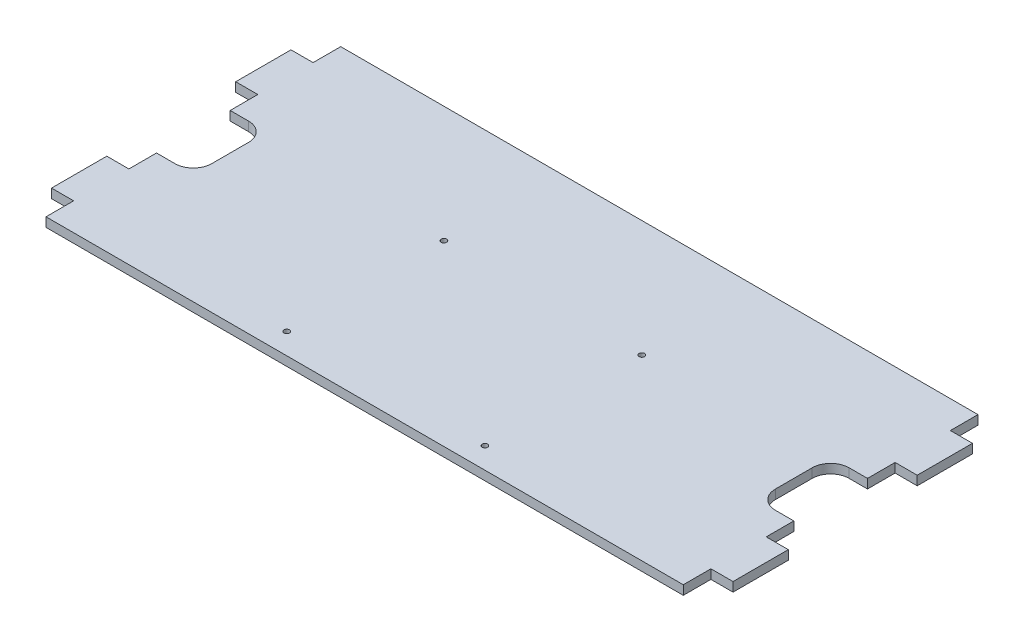
ISO-10303-21;
HEADER;
FILE_DESCRIPTION(('STEP AP214'),'2;1');
FILE_NAME('part.step','',(''),(''),'','','');
FILE_SCHEMA(('AUTOMOTIVE_DESIGN { 1 0 10303 214 1 1 1 1 }'));
ENDSEC;
DATA;
#1=APPLICATION_CONTEXT('core data for automotive mechanical design processes');
#2=APPLICATION_PROTOCOL_DEFINITION('international standard','automotive_design',2000,#1);
#3=PRODUCT_CONTEXT('',#1,'mechanical');
#4=PRODUCT('Part','Part','',(#3));
#5=PRODUCT_RELATED_PRODUCT_CATEGORY('part','',(#4));
#6=PRODUCT_DEFINITION_FORMATION('','',#4);
#7=PRODUCT_DEFINITION_CONTEXT('part definition',#1,'design');
#8=PRODUCT_DEFINITION('design','',#6,#7);
#9=PRODUCT_DEFINITION_SHAPE('','',#8);
#10=(LENGTH_UNIT() NAMED_UNIT(*) SI_UNIT(.MILLI.,.METRE.));
#11=(NAMED_UNIT(*) PLANE_ANGLE_UNIT() SI_UNIT($,.RADIAN.));
#12=(NAMED_UNIT(*) SI_UNIT($,.STERADIAN.) SOLID_ANGLE_UNIT());
#13=UNCERTAINTY_MEASURE_WITH_UNIT(LENGTH_MEASURE(1.E-05),#10,'distance_accuracy_value','');
#14=(GEOMETRIC_REPRESENTATION_CONTEXT(3) GLOBAL_UNCERTAINTY_ASSIGNED_CONTEXT((#13)) GLOBAL_UNIT_ASSIGNED_CONTEXT((#10,
#11,#12)) REPRESENTATION_CONTEXT('',''));
#15=CARTESIAN_POINT('',(0.,0.,0.));
#16=DIRECTION('',(0.,0.,1.));
#17=DIRECTION('',(1.,0.,0.));
#18=AXIS2_PLACEMENT_3D('',#15,#16,#17);
#19=CARTESIAN_POINT('',(173.,5.,-35.));
#20=DIRECTION('',(-1.,0.,0.));
#21=DIRECTION('',(0.,0.,1.));
#22=AXIS2_PLACEMENT_3D('',#19,#20,#21);
#23=PLANE('',#22);
#24=DIRECTION('',(0.,0.,-1.));
#25=VECTOR('',#24,1.);
#26=CARTESIAN_POINT('',(173.,0.,-35.));
#27=LINE('',#26,#25);
#28=CARTESIAN_POINT('',(173.,0.,35.));
#29=VERTEX_POINT('',#28);
#30=CARTESIAN_POINT('',(173.,0.,20.));
#31=VERTEX_POINT('',#30);
#32=EDGE_CURVE('E359',#29,#31,#27,.T.);
#33=ORIENTED_EDGE('',*,*,#32,.T.);
#34=DIRECTION('',(0.,1.,0.));
#35=VECTOR('',#34,1.);
#36=CARTESIAN_POINT('',(173.,0.,20.));
#37=LINE('',#36,#35);
#38=CARTESIAN_POINT('',(173.,5.,20.));
#39=VERTEX_POINT('',#38);
#40=EDGE_CURVE('E458',#31,#39,#37,.T.);
#41=ORIENTED_EDGE('',*,*,#40,.T.);
#42=DIRECTION('',(0.,0.,-1.));
#43=VECTOR('',#42,1.);
#44=CARTESIAN_POINT('',(173.,5.,-35.));
#45=LINE('',#44,#43);
#46=CARTESIAN_POINT('',(173.,5.,35.));
#47=VERTEX_POINT('',#46);
#48=EDGE_CURVE('E499',#47,#39,#45,.T.);
#49=ORIENTED_EDGE('',*,*,#48,.F.);
#50=DIRECTION('',(0.,-1.,0.));
#51=VECTOR('',#50,1.);
#52=CARTESIAN_POINT('',(173.,5.,35.));
#53=LINE('',#52,#51);
#54=EDGE_CURVE('E322',#47,#29,#53,.T.);
#55=ORIENTED_EDGE('',*,*,#54,.T.);
#56=EDGE_LOOP('',(#33,#41,#49,#55));
#57=FACE_BOUND('',#56,.T.);
#58=ADVANCED_FACE('F32',(#57),#23,.F.);
#59=CARTESIAN_POINT('',(-173.,5.,-34.9999999999999));
#60=DIRECTION('',(1.,0.,0.));
#61=DIRECTION('',(0.,0.,-1.));
#62=AXIS2_PLACEMENT_3D('',#59,#60,#61);
#63=PLANE('',#62);
#64=DIRECTION('',(0.,0.,1.));
#65=VECTOR('',#64,1.);
#66=CARTESIAN_POINT('',(-173.,0.,-34.9999999999999));
#67=LINE('',#66,#65);
#68=CARTESIAN_POINT('',(-173.,0.,-34.9999999999999));
#69=VERTEX_POINT('',#68);
#70=CARTESIAN_POINT('',(-173.,0.,-20.));
#71=VERTEX_POINT('',#70);
#72=EDGE_CURVE('E266',#69,#71,#67,.T.);
#73=ORIENTED_EDGE('',*,*,#72,.T.);
#74=DIRECTION('',(0.,1.,0.));
#75=VECTOR('',#74,1.);
#76=CARTESIAN_POINT('',(-173.,0.,-20.));
#77=LINE('',#76,#75);
#78=CARTESIAN_POINT('',(-173.,5.,-20.));
#79=VERTEX_POINT('',#78);
#80=EDGE_CURVE('E395',#71,#79,#77,.T.);
#81=ORIENTED_EDGE('',*,*,#80,.T.);
#82=DIRECTION('',(0.,0.,1.));
#83=VECTOR('',#82,1.);
#84=CARTESIAN_POINT('',(-173.,5.,-34.9999999999999));
#85=LINE('',#84,#83);
#86=CARTESIAN_POINT('',(-173.,5.,-34.9999999999999));
#87=VERTEX_POINT('',#86);
#88=EDGE_CURVE('E397',#87,#79,#85,.T.);
#89=ORIENTED_EDGE('',*,*,#88,.F.);
#90=DIRECTION('',(0.,-1.,0.));
#91=VECTOR('',#90,1.);
#92=CARTESIAN_POINT('',(-173.,5.,-34.9999999999999));
#93=LINE('',#92,#91);
#94=EDGE_CURVE('E292',#87,#69,#93,.T.);
#95=ORIENTED_EDGE('',*,*,#94,.T.);
#96=EDGE_LOOP('',(#73,#81,#89,#95));
#97=FACE_BOUND('',#96,.T.);
#98=ADVANCED_FACE('F393',(#97),#63,.F.);
#99=CARTESIAN_POINT('',(-173.,5.,65.0000000000001));
#100=DIRECTION('',(1.,0.,0.));
#101=DIRECTION('',(0.,0.,-1.));
#102=AXIS2_PLACEMENT_3D('',#99,#100,#101);
#103=PLANE('',#102);
#104=DIRECTION('',(0.,0.,1.));
#105=VECTOR('',#104,1.);
#106=CARTESIAN_POINT('',(-173.,0.,65.0000000000001));
#107=LINE('',#106,#105);
#108=CARTESIAN_POINT('',(-173.,0.,65.0000000000001));
#109=VERTEX_POINT('',#108);
#110=CARTESIAN_POINT('',(-173.,0.,80.));
#111=VERTEX_POINT('',#110);
#112=EDGE_CURVE('E351',#109,#111,#107,.T.);
#113=ORIENTED_EDGE('',*,*,#112,.T.);
#114=DIRECTION('',(0.,-1.,0.));
#115=VECTOR('',#114,1.);
#116=CARTESIAN_POINT('',(-173.,5.,80.));
#117=LINE('',#116,#115);
#118=CARTESIAN_POINT('',(-173.,5.,80.));
#119=VERTEX_POINT('',#118);
#120=EDGE_CURVE('E11',#119,#111,#117,.T.);
#121=ORIENTED_EDGE('',*,*,#120,.F.);
#122=DIRECTION('',(0.,0.,1.));
#123=VECTOR('',#122,1.);
#124=CARTESIAN_POINT('',(-173.,5.,65.0000000000001));
#125=LINE('',#124,#123);
#126=CARTESIAN_POINT('',(-173.,5.,65.0000000000001));
#127=VERTEX_POINT('',#126);
#128=EDGE_CURVE('E279',#127,#119,#125,.T.);
#129=ORIENTED_EDGE('',*,*,#128,.F.);
#130=DIRECTION('',(0.,-1.,0.));
#131=VECTOR('',#130,1.);
#132=CARTESIAN_POINT('',(-173.,5.,65.0000000000001));
#133=LINE('',#132,#131);
#134=EDGE_CURVE('E280',#127,#109,#133,.T.);
#135=ORIENTED_EDGE('',*,*,#134,.T.);
#136=EDGE_LOOP('',(#113,#121,#129,#135));
#137=FACE_BOUND('',#136,.T.);
#138=ADVANCED_FACE('F34',(#137),#103,.F.);
#139=CARTESIAN_POINT('',(173.,5.,79.9999999999999));
#140=DIRECTION('',(0.,0.,-1.));
#141=DIRECTION('',(-1.,0.,0.));
#142=AXIS2_PLACEMENT_3D('',#139,#140,#141);
#143=PLANE('',#142);
#144=DIRECTION('',(1.,0.,0.));
#145=VECTOR('',#144,1.);
#146=CARTESIAN_POINT('',(173.,0.,79.9999999999999));
#147=LINE('',#146,#145);
#148=CARTESIAN_POINT('',(173.,0.,79.9999999999999));
#149=VERTEX_POINT('',#148);
#150=EDGE_CURVE('E345',#111,#149,#147,.T.);
#151=ORIENTED_EDGE('',*,*,#150,.T.);
#152=DIRECTION('',(0.,-1.,0.));
#153=VECTOR('',#152,1.);
#154=CARTESIAN_POINT('',(173.,5.,79.9999999999999));
#155=LINE('',#154,#153);
#156=CARTESIAN_POINT('',(173.,5.,79.9999999999999));
#157=VERTEX_POINT('',#156);
#158=EDGE_CURVE('E40',#157,#149,#155,.T.);
#159=ORIENTED_EDGE('',*,*,#158,.F.);
#160=DIRECTION('',(1.,0.,0.));
#161=VECTOR('',#160,1.);
#162=CARTESIAN_POINT('',(173.,5.,79.9999999999999));
#163=LINE('',#162,#161);
#164=EDGE_CURVE('E489',#119,#157,#163,.T.);
#165=ORIENTED_EDGE('',*,*,#164,.F.);
#166=ORIENTED_EDGE('',*,*,#120,.T.);
#167=EDGE_LOOP('',(#151,#159,#165,#166));
#168=FACE_BOUND('',#167,.T.);
#169=ADVANCED_FACE('F872',(#168),#143,.F.);
#170=CARTESIAN_POINT('',(173.,5.,65.));
#171=DIRECTION('',(-1.,0.,0.));
#172=DIRECTION('',(0.,0.,1.));
#173=AXIS2_PLACEMENT_3D('',#170,#171,#172);
#174=PLANE('',#173);
#175=DIRECTION('',(0.,0.,-1.));
#176=VECTOR('',#175,1.);
#177=CARTESIAN_POINT('',(173.,0.,65.));
#178=LINE('',#177,#176);
#179=CARTESIAN_POINT('',(173.,0.,65.));
#180=VERTEX_POINT('',#179);
#181=EDGE_CURVE('E340',#149,#180,#178,.T.);
#182=ORIENTED_EDGE('',*,*,#181,.T.);
#183=DIRECTION('',(0.,-1.,0.));
#184=VECTOR('',#183,1.);
#185=CARTESIAN_POINT('',(173.,5.,65.));
#186=LINE('',#185,#184);
#187=CARTESIAN_POINT('',(173.,5.,65.));
#188=VERTEX_POINT('',#187);
#189=EDGE_CURVE('E331',#188,#180,#186,.T.);
#190=ORIENTED_EDGE('',*,*,#189,.F.);
#191=DIRECTION('',(0.,0.,-1.));
#192=VECTOR('',#191,1.);
#193=CARTESIAN_POINT('',(173.,5.,65.));
#194=LINE('',#193,#192);
#195=EDGE_CURVE('E341',#157,#188,#194,.T.);
#196=ORIENTED_EDGE('',*,*,#195,.F.);
#197=ORIENTED_EDGE('',*,*,#158,.T.);
#198=EDGE_LOOP('',(#182,#190,#196,#197));
#199=FACE_BOUND('',#198,.T.);
#200=ADVANCED_FACE('F338',(#199),#174,.F.);
#201=CARTESIAN_POINT('',(173.,5.,65.));
#202=DIRECTION('',(0.,0.,-1.));
#203=DIRECTION('',(-1.,0.,0.));
#204=AXIS2_PLACEMENT_3D('',#201,#202,#203);
#205=PLANE('',#204);
#206=DIRECTION('',(1.,0.,0.));
#207=VECTOR('',#206,1.);
#208=CARTESIAN_POINT('',(173.,0.,65.));
#209=LINE('',#208,#207);
#210=CARTESIAN_POINT('',(185.,0.,65.));
#211=VERTEX_POINT('',#210);
#212=EDGE_CURVE('E347',#180,#211,#209,.T.);
#213=ORIENTED_EDGE('',*,*,#212,.T.);
#214=DIRECTION('',(0.,-1.,0.));
#215=VECTOR('',#214,1.);
#216=CARTESIAN_POINT('',(185.,5.,65.));
#217=LINE('',#216,#215);
#218=CARTESIAN_POINT('',(185.,5.,65.));
#219=VERTEX_POINT('',#218);
#220=EDGE_CURVE('E328',#219,#211,#217,.T.);
#221=ORIENTED_EDGE('',*,*,#220,.F.);
#222=DIRECTION('',(1.,0.,0.));
#223=VECTOR('',#222,1.);
#224=CARTESIAN_POINT('',(173.,5.,65.));
#225=LINE('',#224,#223);
#226=EDGE_CURVE('E492',#188,#219,#225,.T.);
#227=ORIENTED_EDGE('',*,*,#226,.F.);
#228=ORIENTED_EDGE('',*,*,#189,.T.);
#229=EDGE_LOOP('',(#213,#221,#227,#228));
#230=FACE_BOUND('',#229,.T.);
#231=ADVANCED_FACE('F876',(#230),#205,.F.);
#232=CARTESIAN_POINT('',(185.,5.,35.));
#233=DIRECTION('',(-1.,0.,0.));
#234=DIRECTION('',(0.,0.,1.));
#235=AXIS2_PLACEMENT_3D('',#232,#233,#234);
#236=PLANE('',#235);
#237=DIRECTION('',(0.,0.,-1.));
#238=VECTOR('',#237,1.);
#239=CARTESIAN_POINT('',(185.,0.,35.));
#240=LINE('',#239,#238);
#241=CARTESIAN_POINT('',(185.,0.,35.));
#242=VERTEX_POINT('',#241);
#243=EDGE_CURVE('E349',#211,#242,#240,.T.);
#244=ORIENTED_EDGE('',*,*,#243,.T.);
#245=DIRECTION('',(0.,-1.,0.));
#246=VECTOR('',#245,1.);
#247=CARTESIAN_POINT('',(185.,5.,35.));
#248=LINE('',#247,#246);
#249=CARTESIAN_POINT('',(185.,5.,35.));
#250=VERTEX_POINT('',#249);
#251=EDGE_CURVE('E325',#250,#242,#248,.T.);
#252=ORIENTED_EDGE('',*,*,#251,.F.);
#253=DIRECTION('',(0.,0.,-1.));
#254=VECTOR('',#253,1.);
#255=CARTESIAN_POINT('',(185.,5.,35.));
#256=LINE('',#255,#254);
#257=EDGE_CURVE('E494',#219,#250,#256,.T.);
#258=ORIENTED_EDGE('',*,*,#257,.F.);
#259=ORIENTED_EDGE('',*,*,#220,.T.);
#260=EDGE_LOOP('',(#244,#252,#258,#259));
#261=FACE_BOUND('',#260,.T.);
#262=ADVANCED_FACE('F553',(#261),#236,.F.);
#263=CARTESIAN_POINT('',(173.,5.,35.));
#264=DIRECTION('',(0.,0.,1.));
#265=DIRECTION('',(1.,0.,0.));
#266=AXIS2_PLACEMENT_3D('',#263,#264,#265);
#267=PLANE('',#266);
#268=DIRECTION('',(-1.,0.,0.));
#269=VECTOR('',#268,1.);
#270=CARTESIAN_POINT('',(173.,0.,35.));
#271=LINE('',#270,#269);
#272=EDGE_CURVE('E356',#242,#29,#271,.T.);
#273=ORIENTED_EDGE('',*,*,#272,.T.);
#274=ORIENTED_EDGE('',*,*,#54,.F.);
#275=DIRECTION('',(-1.,0.,0.));
#276=VECTOR('',#275,1.);
#277=CARTESIAN_POINT('',(173.,5.,35.));
#278=LINE('',#277,#276);
#279=EDGE_CURVE('E496',#250,#47,#278,.T.);
#280=ORIENTED_EDGE('',*,*,#279,.F.);
#281=ORIENTED_EDGE('',*,*,#251,.T.);
#282=EDGE_LOOP('',(#273,#274,#280,#281));
#283=FACE_BOUND('',#282,.T.);
#284=ADVANCED_FACE('F545',(#283),#267,.F.);
#285=CARTESIAN_POINT('',(173.,5.,-20.));
#286=VERTEX_POINT('',#285);
#287=CARTESIAN_POINT('',(173.,5.,-35.));
#288=VERTEX_POINT('',#287);
#289=EDGE_CURVE('E498',#286,#288,#45,.T.);
#290=ORIENTED_EDGE('',*,*,#289,.F.);
#291=DIRECTION('',(0.,1.,0.));
#292=VECTOR('',#291,1.);
#293=CARTESIAN_POINT('',(173.,0.,-20.));
#294=LINE('',#293,#292);
#295=CARTESIAN_POINT('',(173.,0.,-20.));
#296=VERTEX_POINT('',#295);
#297=EDGE_CURVE('E443',#296,#286,#294,.T.);
#298=ORIENTED_EDGE('',*,*,#297,.F.);
#299=CARTESIAN_POINT('',(173.,0.,-35.));
#300=VERTEX_POINT('',#299);
#301=EDGE_CURVE('E358',#296,#300,#27,.T.);
#302=ORIENTED_EDGE('',*,*,#301,.T.);
#303=DIRECTION('',(0.,-1.,0.));
#304=VECTOR('',#303,1.);
#305=CARTESIAN_POINT('',(173.,5.,-35.));
#306=LINE('',#305,#304);
#307=EDGE_CURVE('E319',#288,#300,#306,.T.);
#308=ORIENTED_EDGE('',*,*,#307,.F.);
#309=EDGE_LOOP('',(#290,#298,#302,#308));
#310=FACE_BOUND('',#309,.T.);
#311=ADVANCED_FACE('F536',(#310),#23,.F.);
#312=CARTESIAN_POINT('',(173.,5.,-35.));
#313=DIRECTION('',(0.,0.,-1.));
#314=DIRECTION('',(-1.,0.,0.));
#315=AXIS2_PLACEMENT_3D('',#312,#313,#314);
#316=PLANE('',#315);
#317=DIRECTION('',(1.,0.,0.));
#318=VECTOR('',#317,1.);
#319=CARTESIAN_POINT('',(173.,0.,-35.));
#320=LINE('',#319,#318);
#321=CARTESIAN_POINT('',(185.,0.,-35.0000000000001));
#322=VERTEX_POINT('',#321);
#323=EDGE_CURVE('E362',#300,#322,#320,.T.);
#324=ORIENTED_EDGE('',*,*,#323,.T.);
#325=DIRECTION('',(0.,-1.,0.));
#326=VECTOR('',#325,1.);
#327=CARTESIAN_POINT('',(185.,5.,-35.0000000000001));
#328=LINE('',#327,#326);
#329=CARTESIAN_POINT('',(185.,5.,-35.0000000000001));
#330=VERTEX_POINT('',#329);
#331=EDGE_CURVE('E316',#330,#322,#328,.T.);
#332=ORIENTED_EDGE('',*,*,#331,.F.);
#333=DIRECTION('',(1.,0.,0.));
#334=VECTOR('',#333,1.);
#335=CARTESIAN_POINT('',(173.,5.,-35.));
#336=LINE('',#335,#334);
#337=EDGE_CURVE('E502',#288,#330,#336,.T.);
#338=ORIENTED_EDGE('',*,*,#337,.F.);
#339=ORIENTED_EDGE('',*,*,#307,.T.);
#340=EDGE_LOOP('',(#324,#332,#338,#339));
#341=FACE_BOUND('',#340,.T.);
#342=ADVANCED_FACE('F544',(#341),#316,.F.);
#343=CARTESIAN_POINT('',(185.,5.,-65.0000000000001));
#344=DIRECTION('',(-1.,0.,0.));
#345=DIRECTION('',(0.,0.,1.));
#346=AXIS2_PLACEMENT_3D('',#343,#344,#345);
#347=PLANE('',#346);
#348=DIRECTION('',(0.,0.,-1.));
#349=VECTOR('',#348,1.);
#350=CARTESIAN_POINT('',(185.,0.,-65.0000000000001));
#351=LINE('',#350,#349);
#352=CARTESIAN_POINT('',(185.,0.,-65.0000000000001));
#353=VERTEX_POINT('',#352);
#354=EDGE_CURVE('E364',#322,#353,#351,.T.);
#355=ORIENTED_EDGE('',*,*,#354,.T.);
#356=DIRECTION('',(0.,-1.,0.));
#357=VECTOR('',#356,1.);
#358=CARTESIAN_POINT('',(185.,5.,-65.0000000000001));
#359=LINE('',#358,#357);
#360=CARTESIAN_POINT('',(185.,5.,-65.0000000000001));
#361=VERTEX_POINT('',#360);
#362=EDGE_CURVE('E313',#361,#353,#359,.T.);
#363=ORIENTED_EDGE('',*,*,#362,.F.);
#364=DIRECTION('',(0.,0.,-1.));
#365=VECTOR('',#364,1.);
#366=CARTESIAN_POINT('',(185.,5.,-65.0000000000001));
#367=LINE('',#366,#365);
#368=EDGE_CURVE('E504',#330,#361,#367,.T.);
#369=ORIENTED_EDGE('',*,*,#368,.F.);
#370=ORIENTED_EDGE('',*,*,#331,.T.);
#371=EDGE_LOOP('',(#355,#363,#369,#370));
#372=FACE_BOUND('',#371,.T.);
#373=ADVANCED_FACE('F551',(#372),#347,.F.);
#374=CARTESIAN_POINT('',(173.,5.,-65.0000000000001));
#375=DIRECTION('',(0.,0.,1.));
#376=DIRECTION('',(1.,0.,0.));
#377=AXIS2_PLACEMENT_3D('',#374,#375,#376);
#378=PLANE('',#377);
#379=DIRECTION('',(-1.,0.,0.));
#380=VECTOR('',#379,1.);
#381=CARTESIAN_POINT('',(173.,0.,-65.0000000000001));
#382=LINE('',#381,#380);
#383=CARTESIAN_POINT('',(173.,0.,-65.0000000000001));
#384=VERTEX_POINT('',#383);
#385=EDGE_CURVE('E366',#353,#384,#382,.T.);
#386=ORIENTED_EDGE('',*,*,#385,.T.);
#387=DIRECTION('',(0.,-1.,0.));
#388=VECTOR('',#387,1.);
#389=CARTESIAN_POINT('',(173.,5.,-65.0000000000001));
#390=LINE('',#389,#388);
#391=CARTESIAN_POINT('',(173.,5.,-65.0000000000001));
#392=VERTEX_POINT('',#391);
#393=EDGE_CURVE('E310',#392,#384,#390,.T.);
#394=ORIENTED_EDGE('',*,*,#393,.F.);
#395=DIRECTION('',(-1.,0.,0.));
#396=VECTOR('',#395,1.);
#397=CARTESIAN_POINT('',(173.,5.,-65.0000000000001));
#398=LINE('',#397,#396);
#399=EDGE_CURVE('E506',#361,#392,#398,.T.);
#400=ORIENTED_EDGE('',*,*,#399,.F.);
#401=ORIENTED_EDGE('',*,*,#362,.T.);
#402=EDGE_LOOP('',(#386,#394,#400,#401));
#403=FACE_BOUND('',#402,.T.);
#404=ADVANCED_FACE('F576',(#403),#378,.F.);
#405=CARTESIAN_POINT('',(173.,5.,-80.));
#406=DIRECTION('',(-1.,0.,0.));
#407=DIRECTION('',(0.,0.,1.));
#408=AXIS2_PLACEMENT_3D('',#405,#406,#407);
#409=PLANE('',#408);
#410=DIRECTION('',(0.,0.,-1.));
#411=VECTOR('',#410,1.);
#412=CARTESIAN_POINT('',(173.,0.,-80.));
#413=LINE('',#412,#411);
#414=CARTESIAN_POINT('',(173.,0.,-80.));
#415=VERTEX_POINT('',#414);
#416=EDGE_CURVE('E368',#384,#415,#413,.T.);
#417=ORIENTED_EDGE('',*,*,#416,.T.);
#418=DIRECTION('',(0.,-1.,0.));
#419=VECTOR('',#418,1.);
#420=CARTESIAN_POINT('',(173.,5.,-80.));
#421=LINE('',#420,#419);
#422=CARTESIAN_POINT('',(173.,5.,-80.));
#423=VERTEX_POINT('',#422);
#424=EDGE_CURVE('E307',#423,#415,#421,.T.);
#425=ORIENTED_EDGE('',*,*,#424,.F.);
#426=DIRECTION('',(0.,0.,-1.));
#427=VECTOR('',#426,1.);
#428=CARTESIAN_POINT('',(173.,5.,-80.));
#429=LINE('',#428,#427);
#430=EDGE_CURVE('E508',#392,#423,#429,.T.);
#431=ORIENTED_EDGE('',*,*,#430,.F.);
#432=ORIENTED_EDGE('',*,*,#393,.T.);
#433=EDGE_LOOP('',(#417,#425,#431,#432));
#434=FACE_BOUND('',#433,.T.);
#435=ADVANCED_FACE('F580',(#434),#409,.F.);
#436=CARTESIAN_POINT('',(173.,5.,-80.));
#437=DIRECTION('',(0.,0.,1.));
#438=DIRECTION('',(1.,0.,0.));
#439=AXIS2_PLACEMENT_3D('',#436,#437,#438);
#440=PLANE('',#439);
#441=DIRECTION('',(-1.,0.,0.));
#442=VECTOR('',#441,1.);
#443=CARTESIAN_POINT('',(173.,0.,-80.));
#444=LINE('',#443,#442);
#445=CARTESIAN_POINT('',(-173.,0.,-80.));
#446=VERTEX_POINT('',#445);
#447=EDGE_CURVE('E370',#415,#446,#444,.T.);
#448=ORIENTED_EDGE('',*,*,#447,.T.);
#449=DIRECTION('',(0.,-1.,0.));
#450=VECTOR('',#449,1.);
#451=CARTESIAN_POINT('',(-173.,5.,-80.));
#452=LINE('',#451,#450);
#453=CARTESIAN_POINT('',(-173.,5.,-80.));
#454=VERTEX_POINT('',#453);
#455=EDGE_CURVE('E304',#454,#446,#452,.T.);
#456=ORIENTED_EDGE('',*,*,#455,.F.);
#457=DIRECTION('',(-1.,0.,0.));
#458=VECTOR('',#457,1.);
#459=CARTESIAN_POINT('',(173.,5.,-80.));
#460=LINE('',#459,#458);
#461=EDGE_CURVE('E510',#423,#454,#460,.T.);
#462=ORIENTED_EDGE('',*,*,#461,.F.);
#463=ORIENTED_EDGE('',*,*,#424,.T.);
#464=EDGE_LOOP('',(#448,#456,#462,#463));
#465=FACE_BOUND('',#464,.T.);
#466=ADVANCED_FACE('F585',(#465),#440,.F.);
#467=CARTESIAN_POINT('',(-173.,5.,-80.));
#468=DIRECTION('',(1.,0.,0.));
#469=DIRECTION('',(0.,0.,-1.));
#470=AXIS2_PLACEMENT_3D('',#467,#468,#469);
#471=PLANE('',#470);
#472=DIRECTION('',(0.,0.,1.));
#473=VECTOR('',#472,1.);
#474=CARTESIAN_POINT('',(-173.,0.,-80.));
#475=LINE('',#474,#473);
#476=CARTESIAN_POINT('',(-173.,0.,-65.));
#477=VERTEX_POINT('',#476);
#478=EDGE_CURVE('E372',#446,#477,#475,.T.);
#479=ORIENTED_EDGE('',*,*,#478,.T.);
#480=DIRECTION('',(0.,-1.,0.));
#481=VECTOR('',#480,1.);
#482=CARTESIAN_POINT('',(-173.,5.,-65.));
#483=LINE('',#482,#481);
#484=CARTESIAN_POINT('',(-173.,5.,-65.));
#485=VERTEX_POINT('',#484);
#486=EDGE_CURVE('E301',#485,#477,#483,.T.);
#487=ORIENTED_EDGE('',*,*,#486,.F.);
#488=DIRECTION('',(0.,0.,1.));
#489=VECTOR('',#488,1.);
#490=CARTESIAN_POINT('',(-173.,5.,-80.));
#491=LINE('',#490,#489);
#492=EDGE_CURVE('E512',#454,#485,#491,.T.);
#493=ORIENTED_EDGE('',*,*,#492,.F.);
#494=ORIENTED_EDGE('',*,*,#455,.T.);
#495=EDGE_LOOP('',(#479,#487,#493,#494));
#496=FACE_BOUND('',#495,.T.);
#497=ADVANCED_FACE('F590',(#496),#471,.F.);
#498=CARTESIAN_POINT('',(-173.,5.,-65.));
#499=DIRECTION('',(0.,0.,1.));
#500=DIRECTION('',(1.,0.,0.));
#501=AXIS2_PLACEMENT_3D('',#498,#499,#500);
#502=PLANE('',#501);
#503=DIRECTION('',(-1.,0.,0.));
#504=VECTOR('',#503,1.);
#505=CARTESIAN_POINT('',(-173.,0.,-65.));
#506=LINE('',#505,#504);
#507=CARTESIAN_POINT('',(-185.,0.,-65.));
#508=VERTEX_POINT('',#507);
#509=EDGE_CURVE('E374',#477,#508,#506,.T.);
#510=ORIENTED_EDGE('',*,*,#509,.T.);
#511=DIRECTION('',(0.,-1.,0.));
#512=VECTOR('',#511,1.);
#513=CARTESIAN_POINT('',(-185.,5.,-65.));
#514=LINE('',#513,#512);
#515=CARTESIAN_POINT('',(-185.,5.,-65.));
#516=VERTEX_POINT('',#515);
#517=EDGE_CURVE('E298',#516,#508,#514,.T.);
#518=ORIENTED_EDGE('',*,*,#517,.F.);
#519=DIRECTION('',(-1.,0.,0.));
#520=VECTOR('',#519,1.);
#521=CARTESIAN_POINT('',(-173.,5.,-65.));
#522=LINE('',#521,#520);
#523=EDGE_CURVE('E514',#485,#516,#522,.T.);
#524=ORIENTED_EDGE('',*,*,#523,.F.);
#525=ORIENTED_EDGE('',*,*,#486,.T.);
#526=EDGE_LOOP('',(#510,#518,#524,#525));
#527=FACE_BOUND('',#526,.T.);
#528=ADVANCED_FACE('F593',(#527),#502,.F.);
#529=CARTESIAN_POINT('',(-185.,5.,-65.));
#530=DIRECTION('',(1.,0.,0.));
#531=DIRECTION('',(0.,0.,-1.));
#532=AXIS2_PLACEMENT_3D('',#529,#530,#531);
#533=PLANE('',#532);
#534=DIRECTION('',(0.,0.,1.));
#535=VECTOR('',#534,1.);
#536=CARTESIAN_POINT('',(-185.,0.,-65.));
#537=LINE('',#536,#535);
#538=CARTESIAN_POINT('',(-185.,0.,-35.));
#539=VERTEX_POINT('',#538);
#540=EDGE_CURVE('E270',#508,#539,#537,.T.);
#541=ORIENTED_EDGE('',*,*,#540,.T.);
#542=DIRECTION('',(0.,-1.,0.));
#543=VECTOR('',#542,1.);
#544=CARTESIAN_POINT('',(-185.,5.,-35.));
#545=LINE('',#544,#543);
#546=CARTESIAN_POINT('',(-185.,5.,-35.));
#547=VERTEX_POINT('',#546);
#548=EDGE_CURVE('E295',#547,#539,#545,.T.);
#549=ORIENTED_EDGE('',*,*,#548,.F.);
#550=DIRECTION('',(0.,0.,1.));
#551=VECTOR('',#550,1.);
#552=CARTESIAN_POINT('',(-185.,5.,-65.));
#553=LINE('',#552,#551);
#554=EDGE_CURVE('E515',#516,#547,#553,.T.);
#555=ORIENTED_EDGE('',*,*,#554,.F.);
#556=ORIENTED_EDGE('',*,*,#517,.T.);
#557=EDGE_LOOP('',(#541,#549,#555,#556));
#558=FACE_BOUND('',#557,.T.);
#559=ADVANCED_FACE('F378',(#558),#533,.F.);
#560=CARTESIAN_POINT('',(-173.,5.,-34.9999999999999));
#561=DIRECTION('',(0.,0.,-1.));
#562=DIRECTION('',(-1.,0.,0.));
#563=AXIS2_PLACEMENT_3D('',#560,#561,#562);
#564=PLANE('',#563);
#565=DIRECTION('',(1.,0.,0.));
#566=VECTOR('',#565,1.);
#567=CARTESIAN_POINT('',(-173.,0.,-34.9999999999999));
#568=LINE('',#567,#566);
#569=EDGE_CURVE('E267',#539,#69,#568,.T.);
#570=ORIENTED_EDGE('',*,*,#569,.T.);
#571=ORIENTED_EDGE('',*,*,#94,.F.);
#572=DIRECTION('',(1.,0.,0.));
#573=VECTOR('',#572,1.);
#574=CARTESIAN_POINT('',(-173.,5.,-34.9999999999999));
#575=LINE('',#574,#573);
#576=EDGE_CURVE('E387',#547,#87,#575,.T.);
#577=ORIENTED_EDGE('',*,*,#576,.F.);
#578=ORIENTED_EDGE('',*,*,#548,.T.);
#579=EDGE_LOOP('',(#570,#571,#577,#578));
#580=FACE_BOUND('',#579,.T.);
#581=ADVANCED_FACE('F385',(#580),#564,.F.);
#582=CARTESIAN_POINT('',(-173.,5.,20.));
#583=VERTEX_POINT('',#582);
#584=CARTESIAN_POINT('',(-173.,5.,35.));
#585=VERTEX_POINT('',#584);
#586=EDGE_CURVE('E257',#583,#585,#85,.T.);
#587=ORIENTED_EDGE('',*,*,#586,.F.);
#588=DIRECTION('',(0.,1.,0.));
#589=VECTOR('',#588,1.);
#590=CARTESIAN_POINT('',(-173.,0.,20.));
#591=LINE('',#590,#589);
#592=CARTESIAN_POINT('',(-173.,0.,20.));
#593=VERTEX_POINT('',#592);
#594=EDGE_CURVE('E244',#593,#583,#591,.T.);
#595=ORIENTED_EDGE('',*,*,#594,.F.);
#596=CARTESIAN_POINT('',(-173.,0.,35.));
#597=VERTEX_POINT('',#596);
#598=EDGE_CURVE('E255',#593,#597,#67,.T.);
#599=ORIENTED_EDGE('',*,*,#598,.T.);
#600=DIRECTION('',(0.,-1.,0.));
#601=VECTOR('',#600,1.);
#602=CARTESIAN_POINT('',(-173.,5.,35.));
#603=LINE('',#602,#601);
#604=EDGE_CURVE('E290',#585,#597,#603,.T.);
#605=ORIENTED_EDGE('',*,*,#604,.F.);
#606=EDGE_LOOP('',(#587,#595,#599,#605));
#607=FACE_BOUND('',#606,.T.);
#608=ADVANCED_FACE('F253',(#607),#63,.F.);
#609=CARTESIAN_POINT('',(-173.,5.,35.));
#610=DIRECTION('',(0.,0.,1.));
#611=DIRECTION('',(1.,0.,0.));
#612=AXIS2_PLACEMENT_3D('',#609,#610,#611);
#613=PLANE('',#612);
#614=DIRECTION('',(-1.,0.,0.));
#615=VECTOR('',#614,1.);
#616=CARTESIAN_POINT('',(-173.,0.,35.));
#617=LINE('',#616,#615);
#618=CARTESIAN_POINT('',(-185.,0.,35.));
#619=VERTEX_POINT('',#618);
#620=EDGE_CURVE('E265',#597,#619,#617,.T.);
#621=ORIENTED_EDGE('',*,*,#620,.T.);
#622=DIRECTION('',(0.,-1.,0.));
#623=VECTOR('',#622,1.);
#624=CARTESIAN_POINT('',(-185.,5.,35.));
#625=LINE('',#624,#623);
#626=CARTESIAN_POINT('',(-185.,5.,35.));
#627=VERTEX_POINT('',#626);
#628=EDGE_CURVE('E287',#627,#619,#625,.T.);
#629=ORIENTED_EDGE('',*,*,#628,.F.);
#630=DIRECTION('',(-1.,0.,0.));
#631=VECTOR('',#630,1.);
#632=CARTESIAN_POINT('',(-173.,5.,35.));
#633=LINE('',#632,#631);
#634=EDGE_CURVE('E400',#585,#627,#633,.T.);
#635=ORIENTED_EDGE('',*,*,#634,.F.);
#636=ORIENTED_EDGE('',*,*,#604,.T.);
#637=EDGE_LOOP('',(#621,#629,#635,#636));
#638=FACE_BOUND('',#637,.T.);
#639=ADVANCED_FACE('F655',(#638),#613,.F.);
#640=CARTESIAN_POINT('',(-185.,5.,35.));
#641=DIRECTION('',(1.,0.,0.));
#642=DIRECTION('',(0.,0.,-1.));
#643=AXIS2_PLACEMENT_3D('',#640,#641,#642);
#644=PLANE('',#643);
#645=DIRECTION('',(0.,0.,1.));
#646=VECTOR('',#645,1.);
#647=CARTESIAN_POINT('',(-185.,0.,35.));
#648=LINE('',#647,#646);
#649=CARTESIAN_POINT('',(-185.,0.,65.));
#650=VERTEX_POINT('',#649);
#651=EDGE_CURVE('E275',#619,#650,#648,.T.);
#652=ORIENTED_EDGE('',*,*,#651,.T.);
#653=DIRECTION('',(0.,-1.,0.));
#654=VECTOR('',#653,1.);
#655=CARTESIAN_POINT('',(-185.,5.,65.));
#656=LINE('',#655,#654);
#657=CARTESIAN_POINT('',(-185.,5.,65.));
#658=VERTEX_POINT('',#657);
#659=EDGE_CURVE('E283',#658,#650,#656,.T.);
#660=ORIENTED_EDGE('',*,*,#659,.F.);
#661=DIRECTION('',(0.,0.,1.));
#662=VECTOR('',#661,1.);
#663=CARTESIAN_POINT('',(-185.,5.,35.));
#664=LINE('',#663,#662);
#665=EDGE_CURVE('E402',#627,#658,#664,.T.);
#666=ORIENTED_EDGE('',*,*,#665,.F.);
#667=ORIENTED_EDGE('',*,*,#628,.T.);
#668=EDGE_LOOP('',(#652,#660,#666,#667));
#669=FACE_BOUND('',#668,.T.);
#670=ADVANCED_FACE('F527',(#669),#644,.F.);
#671=CARTESIAN_POINT('',(-173.,5.,65.0000000000001));
#672=DIRECTION('',(0.,0.,-1.));
#673=DIRECTION('',(-1.,0.,0.));
#674=AXIS2_PLACEMENT_3D('',#671,#672,#673);
#675=PLANE('',#674);
#676=DIRECTION('',(1.,0.,0.));
#677=VECTOR('',#676,1.);
#678=CARTESIAN_POINT('',(-173.,0.,65.0000000000001));
#679=LINE('',#678,#677);
#680=EDGE_CURVE('E277',#650,#109,#679,.T.);
#681=ORIENTED_EDGE('',*,*,#680,.T.);
#682=ORIENTED_EDGE('',*,*,#134,.F.);
#683=DIRECTION('',(1.,0.,0.));
#684=VECTOR('',#683,1.);
#685=CARTESIAN_POINT('',(-173.,5.,65.0000000000001));
#686=LINE('',#685,#684);
#687=EDGE_CURVE('E284',#658,#127,#686,.T.);
#688=ORIENTED_EDGE('',*,*,#687,.F.);
#689=ORIENTED_EDGE('',*,*,#659,.T.);
#690=EDGE_LOOP('',(#681,#682,#688,#689));
#691=FACE_BOUND('',#690,.T.);
#692=ADVANCED_FACE('F518',(#691),#675,.F.);
#693=CARTESIAN_POINT('',(0.,5.,0.));
#694=DIRECTION('',(0.,-1.,0.));
#695=DIRECTION('',(0.,0.,-1.));
#696=AXIS2_PLACEMENT_3D('',#693,#694,#695);
#697=PLANE('',#696);
#698=CARTESIAN_POINT('',(-53.75,5.,-16.75));
#699=DIRECTION('',(0.,1.,0.));
#700=DIRECTION('',(0.,0.,1.));
#701=AXIS2_PLACEMENT_3D('',#698,#699,#700);
#702=CIRCLE('',#701,1.5);
#703=CARTESIAN_POINT('',(-53.75,5.,-15.25));
#704=VERTEX_POINT('',#703);
#705=EDGE_CURVE('E426',#704,#704,#702,.T.);
#706=ORIENTED_EDGE('',*,*,#705,.F.);
#707=EDGE_LOOP('',(#706));
#708=FACE_BOUND('',#707,.T.);
#709=CARTESIAN_POINT('',(-53.75,5.,68.5));
#710=DIRECTION('',(0.,1.,0.));
#711=DIRECTION('',(0.,0.,-1.));
#712=AXIS2_PLACEMENT_3D('',#709,#710,#711);
#713=CIRCLE('',#712,1.5);
#714=CARTESIAN_POINT('',(-53.75,5.,67.));
#715=VERTEX_POINT('',#714);
#716=EDGE_CURVE('E425',#715,#715,#713,.T.);
#717=ORIENTED_EDGE('',*,*,#716,.F.);
#718=EDGE_LOOP('',(#717));
#719=FACE_BOUND('',#718,.T.);
#720=CARTESIAN_POINT('',(53.75,5.,68.5));
#721=DIRECTION('',(0.,1.,0.));
#722=DIRECTION('',(0.,0.,1.));
#723=AXIS2_PLACEMENT_3D('',#720,#721,#722);
#724=CIRCLE('',#723,1.5);
#725=CARTESIAN_POINT('',(53.75,5.,70.));
#726=VERTEX_POINT('',#725);
#727=EDGE_CURVE('E479',#726,#726,#724,.T.);
#728=ORIENTED_EDGE('',*,*,#727,.F.);
#729=EDGE_LOOP('',(#728));
#730=FACE_BOUND('',#729,.T.);
#731=CARTESIAN_POINT('',(53.75,5.,-16.75));
#732=DIRECTION('',(0.,1.,0.));
#733=DIRECTION('',(0.,0.,-1.));
#734=AXIS2_PLACEMENT_3D('',#731,#732,#733);
#735=CIRCLE('',#734,1.5);
#736=CARTESIAN_POINT('',(53.75,5.,-18.25));
#737=VERTEX_POINT('',#736);
#738=EDGE_CURVE('E473',#737,#737,#735,.T.);
#739=ORIENTED_EDGE('',*,*,#738,.F.);
#740=EDGE_LOOP('',(#739));
#741=FACE_BOUND('',#740,.T.);
#742=ORIENTED_EDGE('',*,*,#88,.T.);
#743=DIRECTION('',(-1.,0.,0.));
#744=VECTOR('',#743,1.);
#745=CARTESIAN_POINT('',(-173.,5.,-20.));
#746=LINE('',#745,#744);
#747=CARTESIAN_POINT('',(-163.,5.,-20.));
#748=VERTEX_POINT('',#747);
#749=EDGE_CURVE('E249',#748,#79,#746,.T.);
#750=ORIENTED_EDGE('',*,*,#749,.F.);
#751=CARTESIAN_POINT('',(-163.,5.,-10.));
#752=DIRECTION('',(0.,1.,0.));
#753=DIRECTION('',(0.,0.,-1.));
#754=AXIS2_PLACEMENT_3D('',#751,#752,#753);
#755=CIRCLE('',#754,10.);
#756=CARTESIAN_POINT('',(-153.,5.,-10.));
#757=VERTEX_POINT('',#756);
#758=EDGE_CURVE('E853',#757,#748,#755,.T.);
#759=ORIENTED_EDGE('',*,*,#758,.F.);
#760=DIRECTION('',(0.,0.,-1.));
#761=VECTOR('',#760,1.);
#762=CARTESIAN_POINT('',(-153.,5.,10.));
#763=LINE('',#762,#761);
#764=CARTESIAN_POINT('',(-153.,5.,10.));
#765=VERTEX_POINT('',#764);
#766=EDGE_CURVE('E848',#765,#757,#763,.T.);
#767=ORIENTED_EDGE('',*,*,#766,.F.);
#768=CARTESIAN_POINT('',(-163.,5.,10.));
#769=DIRECTION('',(0.,1.,0.));
#770=DIRECTION('',(0.,0.,1.));
#771=AXIS2_PLACEMENT_3D('',#768,#769,#770);
#772=CIRCLE('',#771,10.);
#773=CARTESIAN_POINT('',(-163.,5.,20.));
#774=VERTEX_POINT('',#773);
#775=EDGE_CURVE('E845',#774,#765,#772,.T.);
#776=ORIENTED_EDGE('',*,*,#775,.F.);
#777=DIRECTION('',(1.,0.,0.));
#778=VECTOR('',#777,1.);
#779=CARTESIAN_POINT('',(-173.,5.,20.));
#780=LINE('',#779,#778);
#781=EDGE_CURVE('E461',#583,#774,#780,.T.);
#782=ORIENTED_EDGE('',*,*,#781,.F.);
#783=ORIENTED_EDGE('',*,*,#586,.T.);
#784=ORIENTED_EDGE('',*,*,#634,.T.);
#785=ORIENTED_EDGE('',*,*,#665,.T.);
#786=ORIENTED_EDGE('',*,*,#687,.T.);
#787=ORIENTED_EDGE('',*,*,#128,.T.);
#788=ORIENTED_EDGE('',*,*,#164,.T.);
#789=ORIENTED_EDGE('',*,*,#195,.T.);
#790=ORIENTED_EDGE('',*,*,#226,.T.);
#791=ORIENTED_EDGE('',*,*,#257,.T.);
#792=ORIENTED_EDGE('',*,*,#279,.T.);
#793=ORIENTED_EDGE('',*,*,#48,.T.);
#794=DIRECTION('',(1.,0.,0.));
#795=VECTOR('',#794,1.);
#796=CARTESIAN_POINT('',(173.,5.,20.));
#797=LINE('',#796,#795);
#798=CARTESIAN_POINT('',(163.,5.,20.));
#799=VERTEX_POINT('',#798);
#800=EDGE_CURVE('E432',#799,#39,#797,.T.);
#801=ORIENTED_EDGE('',*,*,#800,.F.);
#802=CARTESIAN_POINT('',(163.,5.,10.));
#803=DIRECTION('',(0.,1.,0.));
#804=DIRECTION('',(0.,0.,1.));
#805=AXIS2_PLACEMENT_3D('',#802,#803,#804);
#806=CIRCLE('',#805,10.);
#807=CARTESIAN_POINT('',(153.,5.,10.));
#808=VERTEX_POINT('',#807);
#809=EDGE_CURVE('E454',#808,#799,#806,.T.);
#810=ORIENTED_EDGE('',*,*,#809,.F.);
#811=DIRECTION('',(0.,0.,1.));
#812=VECTOR('',#811,1.);
#813=CARTESIAN_POINT('',(153.,5.,10.));
#814=LINE('',#813,#812);
#815=CARTESIAN_POINT('',(153.,5.,-10.));
#816=VERTEX_POINT('',#815);
#817=EDGE_CURVE('E451',#816,#808,#814,.T.);
#818=ORIENTED_EDGE('',*,*,#817,.F.);
#819=CARTESIAN_POINT('',(163.,5.,-10.));
#820=DIRECTION('',(0.,1.,0.));
#821=DIRECTION('',(0.,0.,1.));
#822=AXIS2_PLACEMENT_3D('',#819,#820,#821);
#823=CIRCLE('',#822,10.);
#824=CARTESIAN_POINT('',(163.,5.,-20.));
#825=VERTEX_POINT('',#824);
#826=EDGE_CURVE('E447',#825,#816,#823,.T.);
#827=ORIENTED_EDGE('',*,*,#826,.F.);
#828=DIRECTION('',(-1.,0.,0.));
#829=VECTOR('',#828,1.);
#830=CARTESIAN_POINT('',(173.,5.,-20.));
#831=LINE('',#830,#829);
#832=EDGE_CURVE('E444',#286,#825,#831,.T.);
#833=ORIENTED_EDGE('',*,*,#832,.F.);
#834=ORIENTED_EDGE('',*,*,#289,.T.);
#835=ORIENTED_EDGE('',*,*,#337,.T.);
#836=ORIENTED_EDGE('',*,*,#368,.T.);
#837=ORIENTED_EDGE('',*,*,#399,.T.);
#838=ORIENTED_EDGE('',*,*,#430,.T.);
#839=ORIENTED_EDGE('',*,*,#461,.T.);
#840=ORIENTED_EDGE('',*,*,#492,.T.);
#841=ORIENTED_EDGE('',*,*,#523,.T.);
#842=ORIENTED_EDGE('',*,*,#554,.T.);
#843=ORIENTED_EDGE('',*,*,#576,.T.);
#844=EDGE_LOOP('',(#742,#750,#759,#767,#776,#782,#783,#784,#785,#786,#787,#788,#789,#790,#791,
#792,#793,#801,#810,#818,#827,#833,#834,#835,#836,#837,#838,#839,#840,#841,#842,#843));
#845=FACE_BOUND('',#844,.T.);
#846=ADVANCED_FACE('F516',(#708,#719,#730,#741,#845),#697,.F.);
#847=CARTESIAN_POINT('',(0.,0.,0.));
#848=DIRECTION('',(0.,-1.,0.));
#849=DIRECTION('',(0.,0.,-1.));
#850=AXIS2_PLACEMENT_3D('',#847,#848,#849);
#851=PLANE('',#850);
#852=DIRECTION('',(-1.,0.,0.));
#853=VECTOR('',#852,1.);
#854=CARTESIAN_POINT('',(-173.,0.,-20.));
#855=LINE('',#854,#853);
#856=CARTESIAN_POINT('',(-163.,0.,-20.));
#857=VERTEX_POINT('',#856);
#858=EDGE_CURVE('E258',#857,#71,#855,.T.);
#859=ORIENTED_EDGE('',*,*,#858,.T.);
#860=ORIENTED_EDGE('',*,*,#72,.F.);
#861=ORIENTED_EDGE('',*,*,#569,.F.);
#862=ORIENTED_EDGE('',*,*,#540,.F.);
#863=ORIENTED_EDGE('',*,*,#509,.F.);
#864=ORIENTED_EDGE('',*,*,#478,.F.);
#865=ORIENTED_EDGE('',*,*,#447,.F.);
#866=ORIENTED_EDGE('',*,*,#416,.F.);
#867=ORIENTED_EDGE('',*,*,#385,.F.);
#868=ORIENTED_EDGE('',*,*,#354,.F.);
#869=ORIENTED_EDGE('',*,*,#323,.F.);
#870=ORIENTED_EDGE('',*,*,#301,.F.);
#871=DIRECTION('',(-1.,0.,0.));
#872=VECTOR('',#871,1.);
#873=CARTESIAN_POINT('',(173.,0.,-20.));
#874=LINE('',#873,#872);
#875=CARTESIAN_POINT('',(163.,0.,-20.));
#876=VERTEX_POINT('',#875);
#877=EDGE_CURVE('E429',#296,#876,#874,.T.);
#878=ORIENTED_EDGE('',*,*,#877,.T.);
#879=CARTESIAN_POINT('',(163.,0.,-10.));
#880=DIRECTION('',(0.,1.,0.));
#881=DIRECTION('',(0.,0.,1.));
#882=AXIS2_PLACEMENT_3D('',#879,#880,#881);
#883=CIRCLE('',#882,10.);
#884=CARTESIAN_POINT('',(153.,0.,-10.));
#885=VERTEX_POINT('',#884);
#886=EDGE_CURVE('E55',#876,#885,#883,.T.);
#887=ORIENTED_EDGE('',*,*,#886,.T.);
#888=DIRECTION('',(0.,0.,1.));
#889=VECTOR('',#888,1.);
#890=CARTESIAN_POINT('',(153.,0.,10.));
#891=LINE('',#890,#889);
#892=CARTESIAN_POINT('',(153.,0.,10.));
#893=VERTEX_POINT('',#892);
#894=EDGE_CURVE('E434',#885,#893,#891,.T.);
#895=ORIENTED_EDGE('',*,*,#894,.T.);
#896=CARTESIAN_POINT('',(163.,0.,10.));
#897=DIRECTION('',(0.,1.,0.));
#898=DIRECTION('',(0.,0.,1.));
#899=AXIS2_PLACEMENT_3D('',#896,#897,#898);
#900=CIRCLE('',#899,10.);
#901=CARTESIAN_POINT('',(163.,0.,20.));
#902=VERTEX_POINT('',#901);
#903=EDGE_CURVE('E437',#893,#902,#900,.T.);
#904=ORIENTED_EDGE('',*,*,#903,.T.);
#905=DIRECTION('',(1.,0.,0.));
#906=VECTOR('',#905,1.);
#907=CARTESIAN_POINT('',(173.,0.,20.));
#908=LINE('',#907,#906);
#909=EDGE_CURVE('E440',#902,#31,#908,.T.);
#910=ORIENTED_EDGE('',*,*,#909,.T.);
#911=ORIENTED_EDGE('',*,*,#32,.F.);
#912=ORIENTED_EDGE('',*,*,#272,.F.);
#913=ORIENTED_EDGE('',*,*,#243,.F.);
#914=ORIENTED_EDGE('',*,*,#212,.F.);
#915=ORIENTED_EDGE('',*,*,#181,.F.);
#916=ORIENTED_EDGE('',*,*,#150,.F.);
#917=ORIENTED_EDGE('',*,*,#112,.F.);
#918=ORIENTED_EDGE('',*,*,#680,.F.);
#919=ORIENTED_EDGE('',*,*,#651,.F.);
#920=ORIENTED_EDGE('',*,*,#620,.F.);
#921=ORIENTED_EDGE('',*,*,#598,.F.);
#922=DIRECTION('',(1.,0.,0.));
#923=VECTOR('',#922,1.);
#924=CARTESIAN_POINT('',(-173.,0.,20.));
#925=LINE('',#924,#923);
#926=CARTESIAN_POINT('',(-163.,0.,20.));
#927=VERTEX_POINT('',#926);
#928=EDGE_CURVE('E240',#593,#927,#925,.T.);
#929=ORIENTED_EDGE('',*,*,#928,.T.);
#930=CARTESIAN_POINT('',(-163.,0.,10.));
#931=DIRECTION('',(0.,1.,0.));
#932=DIRECTION('',(0.,0.,1.));
#933=AXIS2_PLACEMENT_3D('',#930,#931,#932);
#934=CIRCLE('',#933,10.);
#935=CARTESIAN_POINT('',(-153.,0.,10.));
#936=VERTEX_POINT('',#935);
#937=EDGE_CURVE('E47',#927,#936,#934,.T.);
#938=ORIENTED_EDGE('',*,*,#937,.T.);
#939=DIRECTION('',(0.,0.,-1.));
#940=VECTOR('',#939,1.);
#941=CARTESIAN_POINT('',(-153.,0.,10.));
#942=LINE('',#941,#940);
#943=CARTESIAN_POINT('',(-153.,0.,-10.));
#944=VERTEX_POINT('',#943);
#945=EDGE_CURVE('E860',#936,#944,#942,.T.);
#946=ORIENTED_EDGE('',*,*,#945,.T.);
#947=CARTESIAN_POINT('',(-163.,0.,-10.));
#948=DIRECTION('',(0.,1.,0.));
#949=DIRECTION('',(0.,0.,-1.));
#950=AXIS2_PLACEMENT_3D('',#947,#948,#949);
#951=CIRCLE('',#950,10.);
#952=EDGE_CURVE('E858',#944,#857,#951,.T.);
#953=ORIENTED_EDGE('',*,*,#952,.T.);
#954=EDGE_LOOP('',(#859,#860,#861,#862,#863,#864,#865,#866,#867,#868,#869,#870,#878,#887,#895,
#904,#910,#911,#912,#913,#914,#915,#916,#917,#918,#919,#920,#921,#929,#938,#946,#953));
#955=FACE_BOUND('',#954,.T.);
#956=CARTESIAN_POINT('',(-53.75,0.,-16.75));
#957=DIRECTION('',(0.,1.,0.));
#958=DIRECTION('',(0.,0.,1.));
#959=AXIS2_PLACEMENT_3D('',#956,#957,#958);
#960=CIRCLE('',#959,1.5);
#961=CARTESIAN_POINT('',(-53.75,0.,-15.25));
#962=VERTEX_POINT('',#961);
#963=EDGE_CURVE('E422',#962,#962,#960,.T.);
#964=ORIENTED_EDGE('',*,*,#963,.T.);
#965=EDGE_LOOP('',(#964));
#966=FACE_BOUND('',#965,.T.);
#967=CARTESIAN_POINT('',(-53.75,0.,68.5));
#968=DIRECTION('',(0.,1.,0.));
#969=DIRECTION('',(0.,0.,-1.));
#970=AXIS2_PLACEMENT_3D('',#967,#968,#969);
#971=CIRCLE('',#970,1.5);
#972=CARTESIAN_POINT('',(-53.75,0.,67.));
#973=VERTEX_POINT('',#972);
#974=EDGE_CURVE('E482',#973,#973,#971,.T.);
#975=ORIENTED_EDGE('',*,*,#974,.T.);
#976=EDGE_LOOP('',(#975));
#977=FACE_BOUND('',#976,.T.);
#978=CARTESIAN_POINT('',(53.75,0.,68.5));
#979=DIRECTION('',(0.,1.,0.));
#980=DIRECTION('',(0.,0.,1.));
#981=AXIS2_PLACEMENT_3D('',#978,#979,#980);
#982=CIRCLE('',#981,1.5);
#983=CARTESIAN_POINT('',(53.75,0.,70.));
#984=VERTEX_POINT('',#983);
#985=EDGE_CURVE('E476',#984,#984,#982,.T.);
#986=ORIENTED_EDGE('',*,*,#985,.T.);
#987=EDGE_LOOP('',(#986));
#988=FACE_BOUND('',#987,.T.);
#989=CARTESIAN_POINT('',(53.75,0.,-16.75));
#990=DIRECTION('',(0.,1.,0.));
#991=DIRECTION('',(0.,0.,-1.));
#992=AXIS2_PLACEMENT_3D('',#989,#990,#991);
#993=CIRCLE('',#992,1.5);
#994=CARTESIAN_POINT('',(53.75,0.,-18.25));
#995=VERTEX_POINT('',#994);
#996=EDGE_CURVE('E448',#995,#995,#993,.T.);
#997=ORIENTED_EDGE('',*,*,#996,.T.);
#998=EDGE_LOOP('',(#997));
#999=FACE_BOUND('',#998,.T.);
#1000=ADVANCED_FACE('F262',(#955,#966,#977,#988,#999),#851,.T.);
#1001=CARTESIAN_POINT('',(173.,0.,20.));
#1002=DIRECTION('',(0.,0.,1.));
#1003=DIRECTION('',(1.,0.,0.));
#1004=AXIS2_PLACEMENT_3D('',#1001,#1002,#1003);
#1005=PLANE('',#1004);
#1006=ORIENTED_EDGE('',*,*,#800,.T.);
#1007=ORIENTED_EDGE('',*,*,#40,.F.);
#1008=ORIENTED_EDGE('',*,*,#909,.F.);
#1009=DIRECTION('',(0.,1.,0.));
#1010=VECTOR('',#1009,1.);
#1011=CARTESIAN_POINT('',(163.,0.,20.));
#1012=LINE('',#1011,#1010);
#1013=EDGE_CURVE('E462',#902,#799,#1012,.T.);
#1014=ORIENTED_EDGE('',*,*,#1013,.T.);
#1015=EDGE_LOOP('',(#1006,#1007,#1008,#1014));
#1016=FACE_BOUND('',#1015,.T.);
#1017=ADVANCED_FACE('F525',(#1016),#1005,.F.);
#1018=CARTESIAN_POINT('',(163.,0.,10.));
#1019=DIRECTION('',(0.,1.,0.));
#1020=DIRECTION('',(0.,0.,1.));
#1021=AXIS2_PLACEMENT_3D('',#1018,#1019,#1020);
#1022=CYLINDRICAL_SURFACE('',#1021,10.);
#1023=ORIENTED_EDGE('',*,*,#809,.T.);
#1024=ORIENTED_EDGE('',*,*,#1013,.F.);
#1025=ORIENTED_EDGE('',*,*,#903,.F.);
#1026=DIRECTION('',(0.,1.,0.));
#1027=VECTOR('',#1026,1.);
#1028=CARTESIAN_POINT('',(153.,0.,10.));
#1029=LINE('',#1028,#1027);
#1030=EDGE_CURVE('E464',#893,#808,#1029,.T.);
#1031=ORIENTED_EDGE('',*,*,#1030,.T.);
#1032=EDGE_LOOP('',(#1023,#1024,#1025,#1031));
#1033=FACE_BOUND('',#1032,.T.);
#1034=ADVANCED_FACE('F716',(#1033),#1022,.F.);
#1035=CARTESIAN_POINT('',(153.,0.,10.));
#1036=DIRECTION('',(-1.,0.,0.));
#1037=DIRECTION('',(0.,0.,1.));
#1038=AXIS2_PLACEMENT_3D('',#1035,#1036,#1037);
#1039=PLANE('',#1038);
#1040=ORIENTED_EDGE('',*,*,#817,.T.);
#1041=ORIENTED_EDGE('',*,*,#1030,.F.);
#1042=ORIENTED_EDGE('',*,*,#894,.F.);
#1043=DIRECTION('',(0.,1.,0.));
#1044=VECTOR('',#1043,1.);
#1045=CARTESIAN_POINT('',(153.,0.,-10.));
#1046=LINE('',#1045,#1044);
#1047=EDGE_CURVE('E466',#885,#816,#1046,.T.);
#1048=ORIENTED_EDGE('',*,*,#1047,.T.);
#1049=EDGE_LOOP('',(#1040,#1041,#1042,#1048));
#1050=FACE_BOUND('',#1049,.T.);
#1051=ADVANCED_FACE('F726',(#1050),#1039,.F.);
#1052=CARTESIAN_POINT('',(163.,0.,-10.));
#1053=DIRECTION('',(0.,1.,0.));
#1054=DIRECTION('',(0.,0.,1.));
#1055=AXIS2_PLACEMENT_3D('',#1052,#1053,#1054);
#1056=CYLINDRICAL_SURFACE('',#1055,10.);
#1057=ORIENTED_EDGE('',*,*,#826,.T.);
#1058=ORIENTED_EDGE('',*,*,#1047,.F.);
#1059=ORIENTED_EDGE('',*,*,#886,.F.);
#1060=DIRECTION('',(0.,1.,0.));
#1061=VECTOR('',#1060,1.);
#1062=CARTESIAN_POINT('',(163.,0.,-20.));
#1063=LINE('',#1062,#1061);
#1064=EDGE_CURVE('E468',#876,#825,#1063,.T.);
#1065=ORIENTED_EDGE('',*,*,#1064,.T.);
#1066=EDGE_LOOP('',(#1057,#1058,#1059,#1065));
#1067=FACE_BOUND('',#1066,.T.);
#1068=ADVANCED_FACE('F736',(#1067),#1056,.F.);
#1069=CARTESIAN_POINT('',(173.,0.,-20.));
#1070=DIRECTION('',(0.,0.,-1.));
#1071=DIRECTION('',(-1.,0.,0.));
#1072=AXIS2_PLACEMENT_3D('',#1069,#1070,#1071);
#1073=PLANE('',#1072);
#1074=ORIENTED_EDGE('',*,*,#832,.T.);
#1075=ORIENTED_EDGE('',*,*,#1064,.F.);
#1076=ORIENTED_EDGE('',*,*,#877,.F.);
#1077=ORIENTED_EDGE('',*,*,#297,.T.);
#1078=EDGE_LOOP('',(#1074,#1075,#1076,#1077));
#1079=FACE_BOUND('',#1078,.T.);
#1080=ADVANCED_FACE('F565',(#1079),#1073,.F.);
#1081=CARTESIAN_POINT('',(53.75,0.,-16.75));
#1082=DIRECTION('',(0.,1.,0.));
#1083=DIRECTION('',(0.,0.,1.));
#1084=AXIS2_PLACEMENT_3D('',#1081,#1082,#1083);
#1085=CYLINDRICAL_SURFACE('',#1084,1.5);
#1086=ORIENTED_EDGE('',*,*,#996,.F.);
#1087=EDGE_LOOP('',(#1086));
#1088=FACE_BOUND('',#1087,.T.);
#1089=ORIENTED_EDGE('',*,*,#738,.T.);
#1090=EDGE_LOOP('',(#1089));
#1091=FACE_BOUND('',#1090,.T.);
#1092=ADVANCED_FACE('F754',(#1088,#1091),#1085,.F.);
#1093=CARTESIAN_POINT('',(53.75,0.,68.5));
#1094=DIRECTION('',(0.,1.,0.));
#1095=DIRECTION('',(0.,0.,1.));
#1096=AXIS2_PLACEMENT_3D('',#1093,#1094,#1095);
#1097=CYLINDRICAL_SURFACE('',#1096,1.5);
#1098=ORIENTED_EDGE('',*,*,#985,.F.);
#1099=EDGE_LOOP('',(#1098));
#1100=FACE_BOUND('',#1099,.T.);
#1101=ORIENTED_EDGE('',*,*,#727,.T.);
#1102=EDGE_LOOP('',(#1101));
#1103=FACE_BOUND('',#1102,.T.);
#1104=ADVANCED_FACE('F763',(#1100,#1103),#1097,.F.);
#1105=CARTESIAN_POINT('',(-53.75,0.,68.5));
#1106=DIRECTION('',(0.,1.,0.));
#1107=DIRECTION('',(0.,0.,1.));
#1108=AXIS2_PLACEMENT_3D('',#1105,#1106,#1107);
#1109=CYLINDRICAL_SURFACE('',#1108,1.5);
#1110=ORIENTED_EDGE('',*,*,#974,.F.);
#1111=EDGE_LOOP('',(#1110));
#1112=FACE_BOUND('',#1111,.T.);
#1113=ORIENTED_EDGE('',*,*,#716,.T.);
#1114=EDGE_LOOP('',(#1113));
#1115=FACE_BOUND('',#1114,.T.);
#1116=ADVANCED_FACE('F773',(#1112,#1115),#1109,.F.);
#1117=CARTESIAN_POINT('',(-53.75,0.,-16.75));
#1118=DIRECTION('',(0.,1.,0.));
#1119=DIRECTION('',(0.,0.,1.));
#1120=AXIS2_PLACEMENT_3D('',#1117,#1118,#1119);
#1121=CYLINDRICAL_SURFACE('',#1120,1.5);
#1122=ORIENTED_EDGE('',*,*,#963,.F.);
#1123=EDGE_LOOP('',(#1122));
#1124=FACE_BOUND('',#1123,.T.);
#1125=ORIENTED_EDGE('',*,*,#705,.T.);
#1126=EDGE_LOOP('',(#1125));
#1127=FACE_BOUND('',#1126,.T.);
#1128=ADVANCED_FACE('F783',(#1124,#1127),#1121,.F.);
#1129=CARTESIAN_POINT('',(-173.,0.,-20.));
#1130=DIRECTION('',(0.,0.,-1.));
#1131=DIRECTION('',(-1.,0.,0.));
#1132=AXIS2_PLACEMENT_3D('',#1129,#1130,#1131);
#1133=PLANE('',#1132);
#1134=ORIENTED_EDGE('',*,*,#749,.T.);
#1135=ORIENTED_EDGE('',*,*,#80,.F.);
#1136=ORIENTED_EDGE('',*,*,#858,.F.);
#1137=DIRECTION('',(0.,1.,0.));
#1138=VECTOR('',#1137,1.);
#1139=CARTESIAN_POINT('',(-163.,0.,-20.));
#1140=LINE('',#1139,#1138);
#1141=EDGE_CURVE('E411',#857,#748,#1140,.T.);
#1142=ORIENTED_EDGE('',*,*,#1141,.T.);
#1143=EDGE_LOOP('',(#1134,#1135,#1136,#1142));
#1144=FACE_BOUND('',#1143,.T.);
#1145=ADVANCED_FACE('F792',(#1144),#1133,.F.);
#1146=CARTESIAN_POINT('',(-163.,0.,-10.));
#1147=DIRECTION('',(0.,1.,0.));
#1148=DIRECTION('',(0.,0.,1.));
#1149=AXIS2_PLACEMENT_3D('',#1146,#1147,#1148);
#1150=CYLINDRICAL_SURFACE('',#1149,10.);
#1151=ORIENTED_EDGE('',*,*,#758,.T.);
#1152=ORIENTED_EDGE('',*,*,#1141,.F.);
#1153=ORIENTED_EDGE('',*,*,#952,.F.);
#1154=DIRECTION('',(0.,1.,0.));
#1155=VECTOR('',#1154,1.);
#1156=CARTESIAN_POINT('',(-153.,0.,-10.));
#1157=LINE('',#1156,#1155);
#1158=EDGE_CURVE('E413',#944,#757,#1157,.T.);
#1159=ORIENTED_EDGE('',*,*,#1158,.T.);
#1160=EDGE_LOOP('',(#1151,#1152,#1153,#1159));
#1161=FACE_BOUND('',#1160,.T.);
#1162=ADVANCED_FACE('F802',(#1161),#1150,.F.);
#1163=CARTESIAN_POINT('',(-153.,0.,10.));
#1164=DIRECTION('',(1.,0.,0.));
#1165=DIRECTION('',(0.,0.,-1.));
#1166=AXIS2_PLACEMENT_3D('',#1163,#1164,#1165);
#1167=PLANE('',#1166);
#1168=ORIENTED_EDGE('',*,*,#766,.T.);
#1169=ORIENTED_EDGE('',*,*,#1158,.F.);
#1170=ORIENTED_EDGE('',*,*,#945,.F.);
#1171=DIRECTION('',(0.,1.,0.));
#1172=VECTOR('',#1171,1.);
#1173=CARTESIAN_POINT('',(-153.,0.,10.));
#1174=LINE('',#1173,#1172);
#1175=EDGE_CURVE('E419',#936,#765,#1174,.T.);
#1176=ORIENTED_EDGE('',*,*,#1175,.T.);
#1177=EDGE_LOOP('',(#1168,#1169,#1170,#1176));
#1178=FACE_BOUND('',#1177,.T.);
#1179=ADVANCED_FACE('F812',(#1178),#1167,.F.);
#1180=CARTESIAN_POINT('',(-163.,0.,10.));
#1181=DIRECTION('',(0.,1.,0.));
#1182=DIRECTION('',(0.,0.,1.));
#1183=AXIS2_PLACEMENT_3D('',#1180,#1181,#1182);
#1184=CYLINDRICAL_SURFACE('',#1183,10.);
#1185=ORIENTED_EDGE('',*,*,#775,.T.);
#1186=ORIENTED_EDGE('',*,*,#1175,.F.);
#1187=ORIENTED_EDGE('',*,*,#937,.F.);
#1188=DIRECTION('',(0.,1.,0.));
#1189=VECTOR('',#1188,1.);
#1190=CARTESIAN_POINT('',(-163.,0.,20.));
#1191=LINE('',#1190,#1189);
#1192=EDGE_CURVE('E246',#927,#774,#1191,.T.);
#1193=ORIENTED_EDGE('',*,*,#1192,.T.);
#1194=EDGE_LOOP('',(#1185,#1186,#1187,#1193));
#1195=FACE_BOUND('',#1194,.T.);
#1196=ADVANCED_FACE('F822',(#1195),#1184,.F.);
#1197=CARTESIAN_POINT('',(-173.,0.,20.));
#1198=DIRECTION('',(0.,0.,1.));
#1199=DIRECTION('',(1.,0.,0.));
#1200=AXIS2_PLACEMENT_3D('',#1197,#1198,#1199);
#1201=PLANE('',#1200);
#1202=ORIENTED_EDGE('',*,*,#781,.T.);
#1203=ORIENTED_EDGE('',*,*,#1192,.F.);
#1204=ORIENTED_EDGE('',*,*,#928,.F.);
#1205=ORIENTED_EDGE('',*,*,#594,.T.);
#1206=EDGE_LOOP('',(#1202,#1203,#1204,#1205));
#1207=FACE_BOUND('',#1206,.T.);
#1208=ADVANCED_FACE('F243',(#1207),#1201,.F.);
#1209=CLOSED_SHELL('',(#58,#98,#138,#169,#200,#231,#262,#284,#311,#342,#373,#404,#435,#466,#497,
#528,#559,#581,#608,#639,#670,#692,#846,#1000,#1017,#1034,#1051,#1068,#1080,#1092,#1104,#1116,
#1128,#1145,#1162,#1179,#1196,#1208));
#1210=MANIFOLD_SOLID_BREP('B2',#1209);
#1211=ADVANCED_BREP_SHAPE_REPRESENTATION('',(#18,#1210),#14);
#1212=SHAPE_DEFINITION_REPRESENTATION(#9,#1211);
ENDSEC;
END-ISO-10303-21;
